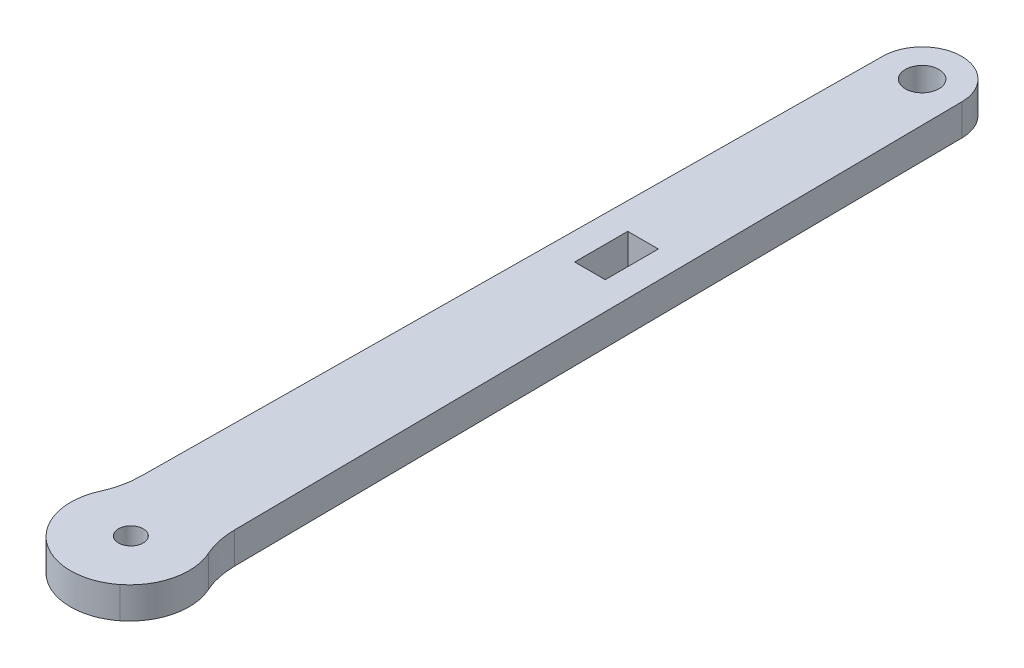
ISO-10303-21;
HEADER;
FILE_DESCRIPTION(('STEP AP214'),'2;1');
FILE_NAME('part.step','',(''),(''),'','','');
FILE_SCHEMA(('AUTOMOTIVE_DESIGN { 1 0 10303 214 1 1 1 1 }'));
ENDSEC;
DATA;
#1=APPLICATION_CONTEXT('core data for automotive mechanical design processes');
#2=APPLICATION_PROTOCOL_DEFINITION('international standard','automotive_design',2000,#1);
#3=PRODUCT_CONTEXT('',#1,'mechanical');
#4=PRODUCT('Part','Part','',(#3));
#5=PRODUCT_RELATED_PRODUCT_CATEGORY('part','',(#4));
#6=PRODUCT_DEFINITION_FORMATION('','',#4);
#7=PRODUCT_DEFINITION_CONTEXT('part definition',#1,'design');
#8=PRODUCT_DEFINITION('design','',#6,#7);
#9=PRODUCT_DEFINITION_SHAPE('','',#8);
#10=(LENGTH_UNIT() NAMED_UNIT(*) SI_UNIT(.MILLI.,.METRE.));
#11=(NAMED_UNIT(*) PLANE_ANGLE_UNIT() SI_UNIT($,.RADIAN.));
#12=(NAMED_UNIT(*) SI_UNIT($,.STERADIAN.) SOLID_ANGLE_UNIT());
#13=UNCERTAINTY_MEASURE_WITH_UNIT(LENGTH_MEASURE(1.E-05),#10,'distance_accuracy_value','');
#14=(GEOMETRIC_REPRESENTATION_CONTEXT(3) GLOBAL_UNCERTAINTY_ASSIGNED_CONTEXT((#13)) GLOBAL_UNIT_ASSIGNED_CONTEXT((#10,
#11,#12)) REPRESENTATION_CONTEXT('',''));
#15=CARTESIAN_POINT('',(0.,0.,0.));
#16=DIRECTION('',(0.,0.,1.));
#17=DIRECTION('',(1.,0.,0.));
#18=AXIS2_PLACEMENT_3D('',#15,#16,#17);
#19=CARTESIAN_POINT('',(-8.30851415914347,3.175,38.3276516647091));
#20=DIRECTION('',(0.,-1.,0.));
#21=DIRECTION('',(0.,0.,-1.));
#22=AXIS2_PLACEMENT_3D('',#19,#20,#21);
#23=PLANE('',#22);
#24=CARTESIAN_POINT('',(-13.2134833560902,3.175,-37.6400557164419));
#25=DIRECTION('',(0.,1.,0.));
#26=DIRECTION('',(0.,0.,1.));
#27=AXIS2_PLACEMENT_3D('',#24,#25,#26);
#28=CIRCLE('',#27,1.7);
#29=CARTESIAN_POINT('',(-13.2134833560902,3.175,-35.9400557164419));
#30=VERTEX_POINT('',#29);
#31=EDGE_CURVE('E173',#30,#30,#28,.T.);
#32=ORIENTED_EDGE('',*,*,#31,.F.);
#33=EDGE_LOOP('',(#32));
#34=FACE_BOUND('',#33,.T.);
#35=CARTESIAN_POINT('',(-13.2209995603122,3.175,42.362850163965));
#36=DIRECTION('',(0.,1.,0.));
#37=DIRECTION('',(0.,0.,1.));
#38=AXIS2_PLACEMENT_3D('',#35,#36,#37);
#39=CIRCLE('',#38,1.25);
#40=CARTESIAN_POINT('',(-13.2209995603122,3.175,43.612850163965));
#41=VERTEX_POINT('',#40);
#42=EDGE_CURVE('E181',#41,#41,#39,.T.);
#43=ORIENTED_EDGE('',*,*,#42,.F.);
#44=EDGE_LOOP('',(#43));
#45=FACE_BOUND('',#44,.T.);
#46=CARTESIAN_POINT('',(-7.77593626425184,3.175,39.965467569372));
#47=CARTESIAN_POINT('',(-8.24264260572534,3.175,38.9443422629617));
#48=CARTESIAN_POINT('',(-8.48834730199274,3.175,37.7363876295867));
#49=CARTESIAN_POINT('',(-8.49920728574165,3.175,36.6135560706554));
#50=B_SPLINE_CURVE_WITH_KNOTS('',3,(#46,#47,#48,#49),.UNSPECIFIED.,.F.,.F.,(4,4),(8.,9.),.UNSPECIFIED.);
#51=CARTESIAN_POINT('',(-7.77593626425184,3.175,39.965467569372));
#52=VERTEX_POINT('',#51);
#53=CARTESIAN_POINT('',(-8.49920728574165,3.175,36.6135560706554));
#54=VERTEX_POINT('',#53);
#55=EDGE_CURVE('E186',#52,#54,#50,.T.);
#56=ORIENTED_EDGE('',*,*,#55,.T.);
#57=DIRECTION('',(-0.00971450716212731,0.,-0.999952813061995));
#58=VECTOR('',#57,1.);
#59=CARTESIAN_POINT('',(-9.22095751637549,3.175,-37.6790623201274));
#60=LINE('',#59,#58);
#61=CARTESIAN_POINT('',(-9.22095751637549,3.175,-37.6790623201274));
#62=VERTEX_POINT('',#61);
#63=EDGE_CURVE('E192',#54,#62,#60,.T.);
#64=ORIENTED_EDGE('',*,*,#63,.T.);
#65=CARTESIAN_POINT('',(-9.22095751637549,3.175,-37.6790623201274));
#66=CARTESIAN_POINT('',(-9.24211206281868,3.175,-39.8727491871709));
#67=CARTESIAN_POINT('',(-11.0232663896474,3.175,-41.6398635846843));
#68=CARTESIAN_POINT('',(-13.2132981317701,3.175,-41.6402347041987));
#69=B_SPLINE_CURVE_WITH_KNOTS('',3,(#65,#66,#67,#68),.UNSPECIFIED.,.F.,.F.,(4,4),(6.,7.),.UNSPECIFIED.);
#70=CARTESIAN_POINT('',(-13.2132981317701,3.175,-41.6402347041987));
#71=VERTEX_POINT('',#70);
#72=EDGE_CURVE('E199',#62,#71,#69,.T.);
#73=ORIENTED_EDGE('',*,*,#72,.T.);
#74=CARTESIAN_POINT('',(-13.2132981317701,3.175,-41.6402347041987));
#75=CARTESIAN_POINT('',(-15.4032128902254,3.175,-41.6404300303051));
#76=CARTESIAN_POINT('',(-17.184484200879,3.175,-39.8734718937589));
#77=CARTESIAN_POINT('',(-17.2062821576902,3.175,-37.6798436245199));
#78=B_SPLINE_CURVE_WITH_KNOTS('',3,(#74,#75,#76,#77),.UNSPECIFIED.,.F.,.F.,(4,4),(5.,6.),.UNSPECIFIED.);
#79=CARTESIAN_POINT('',(-17.2062821576902,3.175,-37.6798436245199));
#80=VERTEX_POINT('',#79);
#81=EDGE_CURVE('E205',#71,#80,#78,.T.);
#82=ORIENTED_EDGE('',*,*,#81,.T.);
#83=DIRECTION('',(-0.00989584203369296,0.,0.999951034956434));
#84=VECTOR('',#83,1.);
#85=CARTESIAN_POINT('',(-17.9415050140242,3.175,36.6126575705927));
#86=LINE('',#85,#84);
#87=CARTESIAN_POINT('',(-17.9415050140242,3.175,36.6126575705927));
#88=VERTEX_POINT('',#87);
#89=EDGE_CURVE('E356',#80,#88,#86,.T.);
#90=ORIENTED_EDGE('',*,*,#89,.T.);
#91=CARTESIAN_POINT('',(-17.9415050140242,3.175,36.6126575705927));
#92=CARTESIAN_POINT('',(-17.9525599706541,3.175,37.735489129524));
#93=CARTESIAN_POINT('',(-18.2007018267687,3.175,38.9434437628758));
#94=CARTESIAN_POINT('',(-18.6674081683343,3.175,39.9643835095362));
#95=B_SPLINE_CURVE_WITH_KNOTS('',3,(#91,#92,#93,#94),.UNSPECIFIED.,.F.,.F.,(4,4),(3.,4.),.UNSPECIFIED.);
#96=CARTESIAN_POINT('',(-18.6674081683343,3.175,39.9643835095362));
#97=VERTEX_POINT('',#96);
#98=EDGE_CURVE('E359',#88,#97,#95,.T.);
#99=ORIENTED_EDGE('',*,*,#98,.T.);
#100=CARTESIAN_POINT('',(-18.6674081683343,3.175,39.9643835095362));
#101=CARTESIAN_POINT('',(-19.8188199158856,3.175,42.483141685904));
#102=CARTESIAN_POINT('',(-19.0992923717392,3.175,45.4644123174979));
#103=CARTESIAN_POINT('',(-16.9262622560372,3.175,47.177802296436));
#104=B_SPLINE_CURVE_WITH_KNOTS('',3,(#100,#101,#102,#103),.UNSPECIFIED.,.F.,.F.,(4,4),(2.,3.),.UNSPECIFIED.);
#105=CARTESIAN_POINT('',(-16.9262622560372,3.175,47.177802296436));
#106=VERTEX_POINT('',#105);
#107=EDGE_CURVE('E360',#97,#106,#104,.T.);
#108=ORIENTED_EDGE('',*,*,#107,.T.);
#109=CARTESIAN_POINT('',(-16.9262622560372,3.175,47.177802296436));
#110=CARTESIAN_POINT('',(-14.7532126430572,3.175,48.8912704057775));
#111=CARTESIAN_POINT('',(-11.6917305671177,3.175,48.891651291632));
#112=CARTESIAN_POINT('',(-9.51829100842583,3.175,47.1785738345028));
#113=B_SPLINE_CURVE_WITH_KNOTS('',3,(#109,#110,#111,#112),.UNSPECIFIED.,.F.,.F.,(4,4),(1.,2.),.UNSPECIFIED.);
#114=CARTESIAN_POINT('',(-9.51829100842583,3.175,47.1785738345028));
#115=VERTEX_POINT('',#114);
#116=EDGE_CURVE('E256',#106,#115,#113,.T.);
#117=ORIENTED_EDGE('',*,*,#116,.T.);
#118=CARTESIAN_POINT('',(-9.51829100842583,3.175,47.1785738345028));
#119=CARTESIAN_POINT('',(-7.34506591979187,3.175,45.4654963773742));
#120=CARTESIAN_POINT('',(-6.62503144615108,3.175,42.4844210718514));
#121=CARTESIAN_POINT('',(-7.77593626425184,3.175,39.965467569372));
#122=B_SPLINE_CURVE_WITH_KNOTS('',3,(#118,#119,#120,#121),.UNSPECIFIED.,.F.,.F.,(4,4),(0.,1.),.UNSPECIFIED.);
#123=EDGE_CURVE('E250',#115,#52,#122,.T.);
#124=ORIENTED_EDGE('',*,*,#123,.T.);
#125=EDGE_LOOP('',(#56,#64,#73,#82,#90,#99,#108,#117,#124));
#126=FACE_BOUND('',#125,.T.);
#127=DIRECTION('',(-1.,0.,0.));
#128=VECTOR('',#127,1.);
#129=CARTESIAN_POINT('',(-11.6728766969984,3.175,-9.43027275571334));
#130=LINE('',#129,#128);
#131=CARTESIAN_POINT('',(-11.6728766969984,3.175,-9.43027275571334));
#132=VERTEX_POINT('',#131);
#133=CARTESIAN_POINT('',(-14.7670167134508,3.175,-9.43027275571334));
#134=VERTEX_POINT('',#133);
#135=EDGE_CURVE('E137',#132,#134,#130,.T.);
#136=ORIENTED_EDGE('',*,*,#135,.F.);
#137=DIRECTION('',(0.,0.,-1.));
#138=VECTOR('',#137,1.);
#139=CARTESIAN_POINT('',(-11.6728766969984,3.175,-4.05671753813072));
#140=LINE('',#139,#138);
#141=CARTESIAN_POINT('',(-11.6728766969984,3.175,-4.05671753813072));
#142=VERTEX_POINT('',#141);
#143=EDGE_CURVE('E159',#142,#132,#140,.T.);
#144=ORIENTED_EDGE('',*,*,#143,.F.);
#145=DIRECTION('',(1.,0.,0.));
#146=VECTOR('',#145,1.);
#147=CARTESIAN_POINT('',(-14.7670167134508,3.175,-4.05671753813072));
#148=LINE('',#147,#146);
#149=CARTESIAN_POINT('',(-14.7670167134508,3.175,-4.05671753813072));
#150=VERTEX_POINT('',#149);
#151=EDGE_CURVE('E157',#150,#142,#148,.T.);
#152=ORIENTED_EDGE('',*,*,#151,.F.);
#153=DIRECTION('',(0.,0.,1.));
#154=VECTOR('',#153,1.);
#155=CARTESIAN_POINT('',(-14.7670167134508,3.175,-9.43027275571334));
#156=LINE('',#155,#154);
#157=EDGE_CURVE('E145',#134,#150,#156,.T.);
#158=ORIENTED_EDGE('',*,*,#157,.F.);
#159=EDGE_LOOP('',(#136,#144,#152,#158));
#160=FACE_BOUND('',#159,.T.);
#161=ADVANCED_FACE('F39',(#34,#45,#126,#160),#23,.F.);
#162=CARTESIAN_POINT('',(-8.30851415914347,0.,38.3276516647091));
#163=DIRECTION('',(0.,-1.,0.));
#164=DIRECTION('',(0.,0.,-1.));
#165=AXIS2_PLACEMENT_3D('',#162,#163,#164);
#166=PLANE('',#165);
#167=CARTESIAN_POINT('',(-13.2209995603122,0.,42.362850163965));
#168=DIRECTION('',(0.,1.,0.));
#169=DIRECTION('',(0.,0.,1.));
#170=AXIS2_PLACEMENT_3D('',#167,#168,#169);
#171=CIRCLE('',#170,1.25);
#172=CARTESIAN_POINT('',(-13.2209995603122,0.,43.612850163965));
#173=VERTEX_POINT('',#172);
#174=EDGE_CURVE('E177',#173,#173,#171,.T.);
#175=ORIENTED_EDGE('',*,*,#174,.T.);
#176=EDGE_LOOP('',(#175));
#177=FACE_BOUND('',#176,.T.);
#178=CARTESIAN_POINT('',(-7.77593626425184,0.,39.965467569372));
#179=CARTESIAN_POINT('',(-8.24264260572534,0.,38.9443422629617));
#180=CARTESIAN_POINT('',(-8.48834730199274,0.,37.7363876295867));
#181=CARTESIAN_POINT('',(-8.49920728574165,0.,36.6135560706554));
#182=B_SPLINE_CURVE_WITH_KNOTS('',3,(#178,#179,#180,#181),.UNSPECIFIED.,.F.,.F.,(4,4),(8.,9.),.UNSPECIFIED.);
#183=CARTESIAN_POINT('',(-7.77593626425184,0.,39.965467569372));
#184=VERTEX_POINT('',#183);
#185=CARTESIAN_POINT('',(-8.49920728574165,0.,36.6135560706554));
#186=VERTEX_POINT('',#185);
#187=EDGE_CURVE('E184',#184,#186,#182,.T.);
#188=ORIENTED_EDGE('',*,*,#187,.F.);
#189=CARTESIAN_POINT('',(-9.51829100842583,0.,47.1785738345028));
#190=CARTESIAN_POINT('',(-7.34506591979187,0.,45.4654963773742));
#191=CARTESIAN_POINT('',(-6.62503144615108,0.,42.4844210718514));
#192=CARTESIAN_POINT('',(-7.77593626425184,0.,39.965467569372));
#193=B_SPLINE_CURVE_WITH_KNOTS('',3,(#189,#190,#191,#192),.UNSPECIFIED.,.F.,.F.,(4,4),(0.,1.),.UNSPECIFIED.);
#194=CARTESIAN_POINT('',(-9.51829100842583,0.,47.1785738345028));
#195=VERTEX_POINT('',#194);
#196=EDGE_CURVE('E193',#195,#184,#193,.T.);
#197=ORIENTED_EDGE('',*,*,#196,.F.);
#198=CARTESIAN_POINT('',(-16.9262622560372,0.,47.177802296436));
#199=CARTESIAN_POINT('',(-14.7532126430572,0.,48.8912704057775));
#200=CARTESIAN_POINT('',(-11.6917305671177,0.,48.891651291632));
#201=CARTESIAN_POINT('',(-9.51829100842583,0.,47.1785738345028));
#202=B_SPLINE_CURVE_WITH_KNOTS('',3,(#198,#199,#200,#201),.UNSPECIFIED.,.F.,.F.,(4,4),(1.,2.),.UNSPECIFIED.);
#203=CARTESIAN_POINT('',(-16.9262622560372,0.,47.177802296436));
#204=VERTEX_POINT('',#203);
#205=EDGE_CURVE('E302',#204,#195,#202,.T.);
#206=ORIENTED_EDGE('',*,*,#205,.F.);
#207=CARTESIAN_POINT('',(-18.6674081683343,0.,39.9643835095362));
#208=CARTESIAN_POINT('',(-19.8188199158856,0.,42.483141685904));
#209=CARTESIAN_POINT('',(-19.0992923717392,0.,45.4644123174979));
#210=CARTESIAN_POINT('',(-16.9262622560372,0.,47.177802296436));
#211=B_SPLINE_CURVE_WITH_KNOTS('',3,(#207,#208,#209,#210),.UNSPECIFIED.,.F.,.F.,(4,4),(2.,3.),.UNSPECIFIED.);
#212=CARTESIAN_POINT('',(-18.6674081683343,0.,39.9643835095362));
#213=VERTEX_POINT('',#212);
#214=EDGE_CURVE('E295',#213,#204,#211,.T.);
#215=ORIENTED_EDGE('',*,*,#214,.F.);
#216=CARTESIAN_POINT('',(-17.9415050140242,0.,36.6126575705927));
#217=CARTESIAN_POINT('',(-17.9525599706541,0.,37.735489129524));
#218=CARTESIAN_POINT('',(-18.2007018267687,0.,38.9434437628758));
#219=CARTESIAN_POINT('',(-18.6674081683343,0.,39.9643835095362));
#220=B_SPLINE_CURVE_WITH_KNOTS('',3,(#216,#217,#218,#219),.UNSPECIFIED.,.F.,.F.,(4,4),(3.,4.),.UNSPECIFIED.);
#221=CARTESIAN_POINT('',(-17.9415050140242,0.,36.6126575705927));
#222=VERTEX_POINT('',#221);
#223=EDGE_CURVE('E291',#222,#213,#220,.T.);
#224=ORIENTED_EDGE('',*,*,#223,.F.);
#225=DIRECTION('',(-0.00989584203369296,0.,0.999951034956434));
#226=VECTOR('',#225,1.);
#227=CARTESIAN_POINT('',(-17.9415050140242,0.,36.6126575705927));
#228=LINE('',#227,#226);
#229=CARTESIAN_POINT('',(-17.2062821576902,0.,-37.6798436245199));
#230=VERTEX_POINT('',#229);
#231=EDGE_CURVE('E286',#230,#222,#228,.T.);
#232=ORIENTED_EDGE('',*,*,#231,.F.);
#233=CARTESIAN_POINT('',(-13.2132981317701,0.,-41.6402347041987));
#234=CARTESIAN_POINT('',(-15.4032128902254,0.,-41.6404300303051));
#235=CARTESIAN_POINT('',(-17.184484200879,0.,-39.8734718937589));
#236=CARTESIAN_POINT('',(-17.2062821576902,0.,-37.6798436245199));
#237=B_SPLINE_CURVE_WITH_KNOTS('',3,(#233,#234,#235,#236),.UNSPECIFIED.,.F.,.F.,(4,4),(5.,6.),.UNSPECIFIED.);
#238=CARTESIAN_POINT('',(-13.2132981317701,0.,-41.6402347041987));
#239=VERTEX_POINT('',#238);
#240=EDGE_CURVE('E279',#239,#230,#237,.T.);
#241=ORIENTED_EDGE('',*,*,#240,.F.);
#242=CARTESIAN_POINT('',(-9.22095751637549,0.,-37.6790623201274));
#243=CARTESIAN_POINT('',(-9.24211206281868,0.,-39.8727491871709));
#244=CARTESIAN_POINT('',(-11.0232663896474,0.,-41.6398635846843));
#245=CARTESIAN_POINT('',(-13.2132981317701,0.,-41.6402347041987));
#246=B_SPLINE_CURVE_WITH_KNOTS('',3,(#242,#243,#244,#245),.UNSPECIFIED.,.F.,.F.,(4,4),(6.,7.),.UNSPECIFIED.);
#247=CARTESIAN_POINT('',(-9.22095751637549,0.,-37.6790623201274));
#248=VERTEX_POINT('',#247);
#249=EDGE_CURVE('E274',#248,#239,#246,.T.);
#250=ORIENTED_EDGE('',*,*,#249,.F.);
#251=DIRECTION('',(-0.00971450716212731,0.,-0.999952813061995));
#252=VECTOR('',#251,1.);
#253=CARTESIAN_POINT('',(-9.22095751637549,0.,-37.6790623201274));
#254=LINE('',#253,#252);
#255=EDGE_CURVE('E268',#186,#248,#254,.T.);
#256=ORIENTED_EDGE('',*,*,#255,.F.);
#257=EDGE_LOOP('',(#188,#197,#206,#215,#224,#232,#241,#250,#256));
#258=FACE_BOUND('',#257,.T.);
#259=CARTESIAN_POINT('',(-13.2134833560902,0.,-37.6400557164419));
#260=DIRECTION('',(0.,1.,0.));
#261=DIRECTION('',(0.,0.,1.));
#262=AXIS2_PLACEMENT_3D('',#259,#260,#261);
#263=CIRCLE('',#262,1.7);
#264=CARTESIAN_POINT('',(-13.2134833560902,0.,-35.9400557164419));
#265=VERTEX_POINT('',#264);
#266=EDGE_CURVE('E153',#265,#265,#263,.T.);
#267=ORIENTED_EDGE('',*,*,#266,.T.);
#268=EDGE_LOOP('',(#267));
#269=FACE_BOUND('',#268,.T.);
#270=DIRECTION('',(0.,0.,-1.));
#271=VECTOR('',#270,1.);
#272=CARTESIAN_POINT('',(-11.6728766969984,0.,-4.05671753813072));
#273=LINE('',#272,#271);
#274=CARTESIAN_POINT('',(-11.6728766969984,0.,-4.05671753813072));
#275=VERTEX_POINT('',#274);
#276=CARTESIAN_POINT('',(-11.6728766969984,0.,-9.43027275571334));
#277=VERTEX_POINT('',#276);
#278=EDGE_CURVE('E146',#275,#277,#273,.T.);
#279=ORIENTED_EDGE('',*,*,#278,.T.);
#280=DIRECTION('',(-1.,0.,0.));
#281=VECTOR('',#280,1.);
#282=CARTESIAN_POINT('',(-11.6728766969984,0.,-9.43027275571334));
#283=LINE('',#282,#281);
#284=CARTESIAN_POINT('',(-14.7670167134508,0.,-9.43027275571334));
#285=VERTEX_POINT('',#284);
#286=EDGE_CURVE('E63',#277,#285,#283,.T.);
#287=ORIENTED_EDGE('',*,*,#286,.T.);
#288=DIRECTION('',(0.,0.,1.));
#289=VECTOR('',#288,1.);
#290=CARTESIAN_POINT('',(-14.7670167134508,0.,-9.43027275571334));
#291=LINE('',#290,#289);
#292=CARTESIAN_POINT('',(-14.7670167134508,0.,-4.05671753813072));
#293=VERTEX_POINT('',#292);
#294=EDGE_CURVE('E152',#285,#293,#291,.T.);
#295=ORIENTED_EDGE('',*,*,#294,.T.);
#296=DIRECTION('',(1.,0.,0.));
#297=VECTOR('',#296,1.);
#298=CARTESIAN_POINT('',(-14.7670167134508,0.,-4.05671753813072));
#299=LINE('',#298,#297);
#300=EDGE_CURVE('E165',#293,#275,#299,.T.);
#301=ORIENTED_EDGE('',*,*,#300,.T.);
#302=EDGE_LOOP('',(#279,#287,#295,#301));
#303=FACE_BOUND('',#302,.T.);
#304=ADVANCED_FACE('F226',(#177,#258,#269,#303),#166,.T.);
#305=DIRECTION('',(0.,-1.,0.));
#306=VECTOR('',#305,1.);
#307=SURFACE_OF_LINEAR_EXTRUSION('',#50,#306);
#308=ORIENTED_EDGE('',*,*,#187,.T.);
#309=DIRECTION('',(0.,-1.,0.));
#310=VECTOR('',#309,1.);
#311=CARTESIAN_POINT('',(-8.49920728574165,3.175,36.6135560706554));
#312=LINE('',#311,#310);
#313=EDGE_CURVE('E11',#54,#186,#312,.T.);
#314=ORIENTED_EDGE('',*,*,#313,.F.);
#315=ORIENTED_EDGE('',*,*,#55,.F.);
#316=DIRECTION('',(0.,-1.,0.));
#317=VECTOR('',#316,1.);
#318=CARTESIAN_POINT('',(-7.77593626425184,3.175,39.965467569372));
#319=LINE('',#318,#317);
#320=EDGE_CURVE('E255',#52,#184,#319,.T.);
#321=ORIENTED_EDGE('',*,*,#320,.T.);
#322=EDGE_LOOP('',(#308,#314,#315,#321));
#323=FACE_BOUND('',#322,.T.);
#324=ADVANCED_FACE('F41',(#323),#307,.F.);
#325=CARTESIAN_POINT('',(-9.22095751637549,3.175,-37.6790623201274));
#326=DIRECTION('',(-0.999952813061995,0.,0.00971450716212731));
#327=DIRECTION('',(0.00971450716212731,0.,0.999952813061995));
#328=AXIS2_PLACEMENT_3D('',#325,#326,#327);
#329=PLANE('',#328);
#330=ORIENTED_EDGE('',*,*,#255,.T.);
#331=DIRECTION('',(0.,-1.,0.));
#332=VECTOR('',#331,1.);
#333=CARTESIAN_POINT('',(-9.22095751637549,3.175,-37.6790623201274));
#334=LINE('',#333,#332);
#335=EDGE_CURVE('E48',#62,#248,#334,.T.);
#336=ORIENTED_EDGE('',*,*,#335,.F.);
#337=ORIENTED_EDGE('',*,*,#63,.F.);
#338=ORIENTED_EDGE('',*,*,#313,.T.);
#339=EDGE_LOOP('',(#330,#336,#337,#338));
#340=FACE_BOUND('',#339,.T.);
#341=ADVANCED_FACE('F218',(#340),#329,.F.);
#342=DIRECTION('',(0.,-1.,0.));
#343=VECTOR('',#342,1.);
#344=SURFACE_OF_LINEAR_EXTRUSION('',#69,#343);
#345=ORIENTED_EDGE('',*,*,#249,.T.);
#346=DIRECTION('',(0.,-1.,0.));
#347=VECTOR('',#346,1.);
#348=CARTESIAN_POINT('',(-13.2132981317701,3.175,-41.6402347041987));
#349=LINE('',#348,#347);
#350=EDGE_CURVE('E335',#71,#239,#349,.T.);
#351=ORIENTED_EDGE('',*,*,#350,.F.);
#352=ORIENTED_EDGE('',*,*,#72,.F.);
#353=ORIENTED_EDGE('',*,*,#335,.T.);
#354=EDGE_LOOP('',(#345,#351,#352,#353));
#355=FACE_BOUND('',#354,.T.);
#356=ADVANCED_FACE('F214',(#355),#344,.F.);
#357=DIRECTION('',(0.,-1.,0.));
#358=VECTOR('',#357,1.);
#359=SURFACE_OF_LINEAR_EXTRUSION('',#78,#358);
#360=ORIENTED_EDGE('',*,*,#240,.T.);
#361=DIRECTION('',(0.,-1.,0.));
#362=VECTOR('',#361,1.);
#363=CARTESIAN_POINT('',(-17.2062821576902,3.175,-37.6798436245199));
#364=LINE('',#363,#362);
#365=EDGE_CURVE('E332',#80,#230,#364,.T.);
#366=ORIENTED_EDGE('',*,*,#365,.F.);
#367=ORIENTED_EDGE('',*,*,#81,.F.);
#368=ORIENTED_EDGE('',*,*,#350,.T.);
#369=EDGE_LOOP('',(#360,#366,#367,#368));
#370=FACE_BOUND('',#369,.T.);
#371=ADVANCED_FACE('F217',(#370),#359,.F.);
#372=CARTESIAN_POINT('',(-17.9415050140242,3.175,36.6126575705927));
#373=DIRECTION('',(0.999951034956434,0.,0.00989584203369296));
#374=DIRECTION('',(0.00989584203369296,0.,-0.999951034956434));
#375=AXIS2_PLACEMENT_3D('',#372,#373,#374);
#376=PLANE('',#375);
#377=ORIENTED_EDGE('',*,*,#231,.T.);
#378=DIRECTION('',(0.,-1.,0.));
#379=VECTOR('',#378,1.);
#380=CARTESIAN_POINT('',(-17.9415050140242,3.175,36.6126575705927));
#381=LINE('',#380,#379);
#382=EDGE_CURVE('E329',#88,#222,#381,.T.);
#383=ORIENTED_EDGE('',*,*,#382,.F.);
#384=ORIENTED_EDGE('',*,*,#89,.F.);
#385=ORIENTED_EDGE('',*,*,#365,.T.);
#386=EDGE_LOOP('',(#377,#383,#384,#385));
#387=FACE_BOUND('',#386,.T.);
#388=ADVANCED_FACE('F354',(#387),#376,.F.);
#389=DIRECTION('',(0.,-1.,0.));
#390=VECTOR('',#389,1.);
#391=SURFACE_OF_LINEAR_EXTRUSION('',#95,#390);
#392=ORIENTED_EDGE('',*,*,#223,.T.);
#393=DIRECTION('',(0.,-1.,0.));
#394=VECTOR('',#393,1.);
#395=CARTESIAN_POINT('',(-18.6674081683343,3.175,39.9643835095362));
#396=LINE('',#395,#394);
#397=EDGE_CURVE('E326',#97,#213,#396,.T.);
#398=ORIENTED_EDGE('',*,*,#397,.F.);
#399=ORIENTED_EDGE('',*,*,#98,.F.);
#400=ORIENTED_EDGE('',*,*,#382,.T.);
#401=EDGE_LOOP('',(#392,#398,#399,#400));
#402=FACE_BOUND('',#401,.T.);
#403=ADVANCED_FACE('F372',(#402),#391,.F.);
#404=DIRECTION('',(0.,-1.,0.));
#405=VECTOR('',#404,1.);
#406=SURFACE_OF_LINEAR_EXTRUSION('',#104,#405);
#407=ORIENTED_EDGE('',*,*,#214,.T.);
#408=DIRECTION('',(0.,-1.,0.));
#409=VECTOR('',#408,1.);
#410=CARTESIAN_POINT('',(-16.9262622560372,3.175,47.177802296436));
#411=LINE('',#410,#409);
#412=EDGE_CURVE('E323',#106,#204,#411,.T.);
#413=ORIENTED_EDGE('',*,*,#412,.F.);
#414=ORIENTED_EDGE('',*,*,#107,.F.);
#415=ORIENTED_EDGE('',*,*,#397,.T.);
#416=EDGE_LOOP('',(#407,#413,#414,#415));
#417=FACE_BOUND('',#416,.T.);
#418=ADVANCED_FACE('F374',(#417),#406,.F.);
#419=DIRECTION('',(0.,-1.,0.));
#420=VECTOR('',#419,1.);
#421=SURFACE_OF_LINEAR_EXTRUSION('',#113,#420);
#422=ORIENTED_EDGE('',*,*,#205,.T.);
#423=DIRECTION('',(0.,-1.,0.));
#424=VECTOR('',#423,1.);
#425=CARTESIAN_POINT('',(-9.51829100842583,3.175,47.1785738345028));
#426=LINE('',#425,#424);
#427=EDGE_CURVE('E320',#115,#195,#426,.T.);
#428=ORIENTED_EDGE('',*,*,#427,.F.);
#429=ORIENTED_EDGE('',*,*,#116,.F.);
#430=ORIENTED_EDGE('',*,*,#412,.T.);
#431=EDGE_LOOP('',(#422,#428,#429,#430));
#432=FACE_BOUND('',#431,.T.);
#433=ADVANCED_FACE('F246',(#432),#421,.F.);
#434=DIRECTION('',(0.,-1.,0.));
#435=VECTOR('',#434,1.);
#436=SURFACE_OF_LINEAR_EXTRUSION('',#122,#435);
#437=ORIENTED_EDGE('',*,*,#196,.T.);
#438=ORIENTED_EDGE('',*,*,#320,.F.);
#439=ORIENTED_EDGE('',*,*,#123,.F.);
#440=ORIENTED_EDGE('',*,*,#427,.T.);
#441=EDGE_LOOP('',(#437,#438,#439,#440));
#442=FACE_BOUND('',#441,.T.);
#443=ADVANCED_FACE('F242',(#442),#436,.F.);
#444=CARTESIAN_POINT('',(-13.2209995603122,3.175,42.362850163965));
#445=DIRECTION('',(0.,-1.,0.));
#446=DIRECTION('',(0.,0.,-1.));
#447=AXIS2_PLACEMENT_3D('',#444,#445,#446);
#448=CYLINDRICAL_SURFACE('',#447,1.25);
#449=ORIENTED_EDGE('',*,*,#42,.T.);
#450=EDGE_LOOP('',(#449));
#451=FACE_BOUND('',#450,.T.);
#452=ORIENTED_EDGE('',*,*,#174,.F.);
#453=EDGE_LOOP('',(#452));
#454=FACE_BOUND('',#453,.T.);
#455=ADVANCED_FACE('F239',(#451,#454),#448,.F.);
#456=CARTESIAN_POINT('',(-13.2134833560902,3.175,-37.6400557164419));
#457=DIRECTION('',(0.,-1.,0.));
#458=DIRECTION('',(0.,0.,-1.));
#459=AXIS2_PLACEMENT_3D('',#456,#457,#458);
#460=CYLINDRICAL_SURFACE('',#459,1.7);
#461=ORIENTED_EDGE('',*,*,#31,.T.);
#462=EDGE_LOOP('',(#461));
#463=FACE_BOUND('',#462,.T.);
#464=ORIENTED_EDGE('',*,*,#266,.F.);
#465=EDGE_LOOP('',(#464));
#466=FACE_BOUND('',#465,.T.);
#467=ADVANCED_FACE('F448',(#463,#466),#460,.F.);
#468=CARTESIAN_POINT('',(-11.6728766969984,3.175,-9.43027275571334));
#469=DIRECTION('',(0.,0.,1.));
#470=DIRECTION('',(1.,0.,0.));
#471=AXIS2_PLACEMENT_3D('',#468,#469,#470);
#472=PLANE('',#471);
#473=ORIENTED_EDGE('',*,*,#286,.F.);
#474=DIRECTION('',(0.,-1.,0.));
#475=VECTOR('',#474,1.);
#476=CARTESIAN_POINT('',(-11.6728766969984,3.175,-9.43027275571334));
#477=LINE('',#476,#475);
#478=EDGE_CURVE('E141',#132,#277,#477,.T.);
#479=ORIENTED_EDGE('',*,*,#478,.F.);
#480=ORIENTED_EDGE('',*,*,#135,.T.);
#481=DIRECTION('',(0.,-1.,0.));
#482=VECTOR('',#481,1.);
#483=CARTESIAN_POINT('',(-14.7670167134508,3.175,-9.43027275571334));
#484=LINE('',#483,#482);
#485=EDGE_CURVE('E140',#134,#285,#484,.T.);
#486=ORIENTED_EDGE('',*,*,#485,.T.);
#487=EDGE_LOOP('',(#473,#479,#480,#486));
#488=FACE_BOUND('',#487,.T.);
#489=ADVANCED_FACE('F139',(#488),#472,.T.);
#490=CARTESIAN_POINT('',(-14.7670167134508,3.175,-9.43027275571334));
#491=DIRECTION('',(1.,0.,0.));
#492=DIRECTION('',(0.,0.,-1.));
#493=AXIS2_PLACEMENT_3D('',#490,#491,#492);
#494=PLANE('',#493);
#495=ORIENTED_EDGE('',*,*,#294,.F.);
#496=ORIENTED_EDGE('',*,*,#485,.F.);
#497=ORIENTED_EDGE('',*,*,#157,.T.);
#498=DIRECTION('',(0.,-1.,0.));
#499=VECTOR('',#498,1.);
#500=CARTESIAN_POINT('',(-14.7670167134508,3.175,-4.05671753813072));
#501=LINE('',#500,#499);
#502=EDGE_CURVE('E154',#150,#293,#501,.T.);
#503=ORIENTED_EDGE('',*,*,#502,.T.);
#504=EDGE_LOOP('',(#495,#496,#497,#503));
#505=FACE_BOUND('',#504,.T.);
#506=ADVANCED_FACE('F149',(#505),#494,.T.);
#507=CARTESIAN_POINT('',(-14.7670167134508,3.175,-4.05671753813072));
#508=DIRECTION('',(0.,0.,-1.));
#509=DIRECTION('',(-1.,0.,0.));
#510=AXIS2_PLACEMENT_3D('',#507,#508,#509);
#511=PLANE('',#510);
#512=ORIENTED_EDGE('',*,*,#300,.F.);
#513=ORIENTED_EDGE('',*,*,#502,.F.);
#514=ORIENTED_EDGE('',*,*,#151,.T.);
#515=DIRECTION('',(0.,-1.,0.));
#516=VECTOR('',#515,1.);
#517=CARTESIAN_POINT('',(-11.6728766969984,3.175,-4.05671753813072));
#518=LINE('',#517,#516);
#519=EDGE_CURVE('E55',#142,#275,#518,.T.);
#520=ORIENTED_EDGE('',*,*,#519,.T.);
#521=EDGE_LOOP('',(#512,#513,#514,#520));
#522=FACE_BOUND('',#521,.T.);
#523=ADVANCED_FACE('F470',(#522),#511,.T.);
#524=CARTESIAN_POINT('',(-11.6728766969984,3.175,-4.05671753813072));
#525=DIRECTION('',(-1.,0.,0.));
#526=DIRECTION('',(0.,0.,1.));
#527=AXIS2_PLACEMENT_3D('',#524,#525,#526);
#528=PLANE('',#527);
#529=ORIENTED_EDGE('',*,*,#278,.F.);
#530=ORIENTED_EDGE('',*,*,#519,.F.);
#531=ORIENTED_EDGE('',*,*,#143,.T.);
#532=ORIENTED_EDGE('',*,*,#478,.T.);
#533=EDGE_LOOP('',(#529,#530,#531,#532));
#534=FACE_BOUND('',#533,.T.);
#535=ADVANCED_FACE('F478',(#534),#528,.T.);
#536=CLOSED_SHELL('',(#161,#304,#324,#341,#356,#371,#388,#403,#418,#433,#443,#455,#467,#489,
#506,#523,#535));
#537=MANIFOLD_SOLID_BREP('B2',#536);
#538=ADVANCED_BREP_SHAPE_REPRESENTATION('',(#18,#537),#14);
#539=SHAPE_DEFINITION_REPRESENTATION(#9,#538);
ENDSEC;
END-ISO-10303-21;
